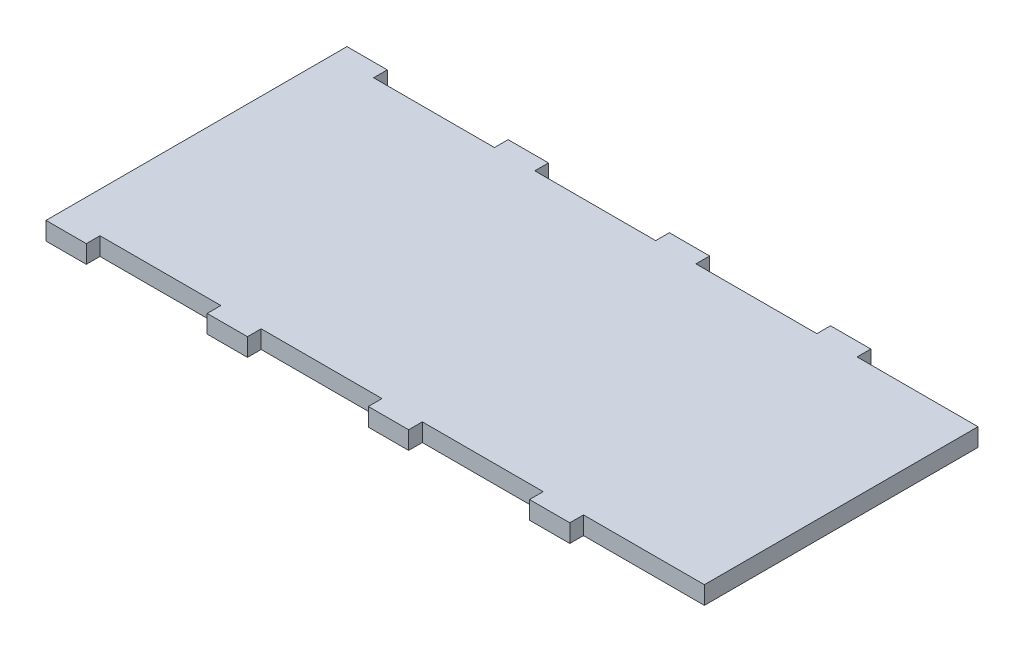
ISO-10303-21;
HEADER;
FILE_DESCRIPTION(('STEP AP214'),'2;1');
FILE_NAME('part.step','',(''),(''),'','','');
FILE_SCHEMA(('AUTOMOTIVE_DESIGN { 1 0 10303 214 1 1 1 1 }'));
ENDSEC;
DATA;
#1=APPLICATION_CONTEXT('core data for automotive mechanical design processes');
#2=APPLICATION_PROTOCOL_DEFINITION('international standard','automotive_design',2000,#1);
#3=PRODUCT_CONTEXT('',#1,'mechanical');
#4=PRODUCT('Part','Part','',(#3));
#5=PRODUCT_RELATED_PRODUCT_CATEGORY('part','',(#4));
#6=PRODUCT_DEFINITION_FORMATION('','',#4);
#7=PRODUCT_DEFINITION_CONTEXT('part definition',#1,'design');
#8=PRODUCT_DEFINITION('design','',#6,#7);
#9=PRODUCT_DEFINITION_SHAPE('','',#8);
#10=(LENGTH_UNIT() NAMED_UNIT(*) SI_UNIT(.MILLI.,.METRE.));
#11=(NAMED_UNIT(*) PLANE_ANGLE_UNIT() SI_UNIT($,.RADIAN.));
#12=(NAMED_UNIT(*) SI_UNIT($,.STERADIAN.) SOLID_ANGLE_UNIT());
#13=UNCERTAINTY_MEASURE_WITH_UNIT(LENGTH_MEASURE(1.E-05),#10,'distance_accuracy_value','');
#14=(GEOMETRIC_REPRESENTATION_CONTEXT(3) GLOBAL_UNCERTAINTY_ASSIGNED_CONTEXT((#13)) GLOBAL_UNIT_ASSIGNED_CONTEXT((#10,
#11,#12)) REPRESENTATION_CONTEXT('',''));
#15=CARTESIAN_POINT('',(0.,0.,0.));
#16=DIRECTION('',(0.,0.,1.));
#17=DIRECTION('',(1.,0.,0.));
#18=AXIS2_PLACEMENT_3D('',#15,#16,#17);
#19=CARTESIAN_POINT('',(22.4424875,2.54,0.));
#20=DIRECTION('',(-1.,0.,0.));
#21=DIRECTION('',(0.,0.,-1.));
#22=AXIS2_PLACEMENT_3D('',#19,#20,#21);
#23=PLANE('',#22);
#24=DIRECTION('',(0.,1.,0.));
#25=VECTOR('',#24,1.);
#26=CARTESIAN_POINT('',(22.4424875,2.54,7.62));
#27=LINE('',#26,#25);
#28=CARTESIAN_POINT('',(22.4424875,-7.46,7.62));
#29=VERTEX_POINT('',#28);
#30=CARTESIAN_POINT('',(22.4424875,2.54,7.62));
#31=VERTEX_POINT('',#30);
#32=EDGE_CURVE('E11',#29,#31,#27,.T.);
#33=ORIENTED_EDGE('',*,*,#32,.F.);
#34=DIRECTION('',(0.,0.,-1.));
#35=VECTOR('',#34,1.);
#36=CARTESIAN_POINT('',(22.4424875,-7.46,0.));
#37=LINE('',#36,#35);
#38=CARTESIAN_POINT('',(22.4424875,-7.46,0.));
#39=VERTEX_POINT('',#38);
#40=EDGE_CURVE('E178',#29,#39,#37,.T.);
#41=ORIENTED_EDGE('',*,*,#40,.T.);
#42=DIRECTION('',(0.,1.,0.));
#43=VECTOR('',#42,1.);
#44=CARTESIAN_POINT('',(22.4424875,2.54,0.));
#45=LINE('',#44,#43);
#46=CARTESIAN_POINT('',(22.4424875,2.54,0.));
#47=VERTEX_POINT('',#46);
#48=EDGE_CURVE('E49',#39,#47,#45,.T.);
#49=ORIENTED_EDGE('',*,*,#48,.T.);
#50=DIRECTION('',(0.,0.,-1.));
#51=VECTOR('',#50,1.);
#52=CARTESIAN_POINT('',(22.4424875,2.54,0.));
#53=LINE('',#52,#51);
#54=EDGE_CURVE('E361',#31,#47,#53,.T.);
#55=ORIENTED_EDGE('',*,*,#54,.F.);
#56=EDGE_LOOP('',(#33,#41,#49,#55));
#57=FACE_BOUND('',#56,.T.);
#58=ADVANCED_FACE('F39',(#57),#23,.F.);
#59=CARTESIAN_POINT('',(0.,2.54,0.));
#60=DIRECTION('',(0.,0.,-1.));
#61=DIRECTION('',(1.,0.,0.));
#62=AXIS2_PLACEMENT_3D('',#59,#60,#61);
#63=PLANE('',#62);
#64=ORIENTED_EDGE('',*,*,#48,.F.);
#65=DIRECTION('',(1.,0.,0.));
#66=VECTOR('',#65,1.);
#67=CARTESIAN_POINT('',(0.,-7.46,0.));
#68=LINE('',#67,#66);
#69=CARTESIAN_POINT('',(89.76995,-7.46,0.));
#70=VERTEX_POINT('',#69);
#71=EDGE_CURVE('E269',#39,#70,#68,.T.);
#72=ORIENTED_EDGE('',*,*,#71,.T.);
#73=DIRECTION('',(0.,1.,0.));
#74=VECTOR('',#73,1.);
#75=CARTESIAN_POINT('',(89.76995,2.54,0.));
#76=LINE('',#75,#74);
#77=CARTESIAN_POINT('',(89.76995,2.54,0.));
#78=VERTEX_POINT('',#77);
#79=EDGE_CURVE('E354',#70,#78,#76,.T.);
#80=ORIENTED_EDGE('',*,*,#79,.T.);
#81=DIRECTION('',(1.,0.,0.));
#82=VECTOR('',#81,1.);
#83=CARTESIAN_POINT('',(0.,2.54,0.));
#84=LINE('',#83,#82);
#85=EDGE_CURVE('E370',#47,#78,#84,.T.);
#86=ORIENTED_EDGE('',*,*,#85,.F.);
#87=EDGE_LOOP('',(#64,#72,#80,#86));
#88=FACE_BOUND('',#87,.T.);
#89=ADVANCED_FACE('F373',(#88),#63,.F.);
#90=CARTESIAN_POINT('',(89.76995,2.54,0.));
#91=DIRECTION('',(1.,0.,0.));
#92=DIRECTION('',(0.,0.,1.));
#93=AXIS2_PLACEMENT_3D('',#90,#91,#92);
#94=PLANE('',#93);
#95=ORIENTED_EDGE('',*,*,#79,.F.);
#96=DIRECTION('',(0.,0.,-1.));
#97=VECTOR('',#96,1.);
#98=CARTESIAN_POINT('',(89.76995,-7.46,0.));
#99=LINE('',#98,#97);
#100=CARTESIAN_POINT('',(89.76995,-7.46,7.61999999999999));
#101=VERTEX_POINT('',#100);
#102=EDGE_CURVE('E266',#70,#101,#99,.F.);
#103=ORIENTED_EDGE('',*,*,#102,.T.);
#104=DIRECTION('',(0.,1.,0.));
#105=VECTOR('',#104,1.);
#106=CARTESIAN_POINT('',(89.76995,2.54,7.61999999999999));
#107=LINE('',#106,#105);
#108=CARTESIAN_POINT('',(89.76995,2.54,7.61999999999999));
#109=VERTEX_POINT('',#108);
#110=EDGE_CURVE('E351',#101,#109,#107,.T.);
#111=ORIENTED_EDGE('',*,*,#110,.T.);
#112=DIRECTION('',(0.,0.,1.));
#113=VECTOR('',#112,1.);
#114=CARTESIAN_POINT('',(89.76995,2.54,0.));
#115=LINE('',#114,#113);
#116=EDGE_CURVE('E374',#78,#109,#115,.T.);
#117=ORIENTED_EDGE('',*,*,#116,.F.);
#118=EDGE_LOOP('',(#95,#103,#111,#117));
#119=FACE_BOUND('',#118,.T.);
#120=ADVANCED_FACE('F546',(#119),#94,.F.);
#121=CARTESIAN_POINT('',(89.76995,2.54,7.61999999999999));
#122=DIRECTION('',(0.,0.,-1.));
#123=DIRECTION('',(1.,0.,0.));
#124=AXIS2_PLACEMENT_3D('',#121,#122,#123);
#125=PLANE('',#124);
#126=ORIENTED_EDGE('',*,*,#110,.F.);
#127=DIRECTION('',(1.,0.,0.));
#128=VECTOR('',#127,1.);
#129=CARTESIAN_POINT('',(0.,-7.46,7.61999999999999));
#130=LINE('',#129,#128);
#131=CARTESIAN_POINT('',(112.2124375,-7.46,7.61999999999999));
#132=VERTEX_POINT('',#131);
#133=EDGE_CURVE('E263',#101,#132,#130,.T.);
#134=ORIENTED_EDGE('',*,*,#133,.T.);
#135=DIRECTION('',(0.,1.,0.));
#136=VECTOR('',#135,1.);
#137=CARTESIAN_POINT('',(112.2124375,2.54,7.61999999999999));
#138=LINE('',#137,#136);
#139=CARTESIAN_POINT('',(112.2124375,2.54,7.61999999999999));
#140=VERTEX_POINT('',#139);
#141=EDGE_CURVE('E348',#132,#140,#138,.T.);
#142=ORIENTED_EDGE('',*,*,#141,.T.);
#143=DIRECTION('',(1.,0.,0.));
#144=VECTOR('',#143,1.);
#145=CARTESIAN_POINT('',(89.76995,2.54,7.61999999999999));
#146=LINE('',#145,#144);
#147=EDGE_CURVE('E378',#109,#140,#146,.T.);
#148=ORIENTED_EDGE('',*,*,#147,.F.);
#149=EDGE_LOOP('',(#126,#134,#142,#148));
#150=FACE_BOUND('',#149,.T.);
#151=ADVANCED_FACE('F553',(#150),#125,.F.);
#152=CARTESIAN_POINT('',(112.2124375,2.54,0.));
#153=DIRECTION('',(-1.,0.,0.));
#154=DIRECTION('',(0.,0.,-1.));
#155=AXIS2_PLACEMENT_3D('',#152,#153,#154);
#156=PLANE('',#155);
#157=ORIENTED_EDGE('',*,*,#141,.F.);
#158=DIRECTION('',(0.,0.,-1.));
#159=VECTOR('',#158,1.);
#160=CARTESIAN_POINT('',(112.2124375,-7.46,0.));
#161=LINE('',#160,#159);
#162=CARTESIAN_POINT('',(112.2124375,-7.46,0.));
#163=VERTEX_POINT('',#162);
#164=EDGE_CURVE('E260',#132,#163,#161,.T.);
#165=ORIENTED_EDGE('',*,*,#164,.T.);
#166=DIRECTION('',(0.,1.,0.));
#167=VECTOR('',#166,1.);
#168=CARTESIAN_POINT('',(112.2124375,2.54,0.));
#169=LINE('',#168,#167);
#170=CARTESIAN_POINT('',(112.2124375,2.54,0.));
#171=VERTEX_POINT('',#170);
#172=EDGE_CURVE('E345',#163,#171,#169,.T.);
#173=ORIENTED_EDGE('',*,*,#172,.T.);
#174=DIRECTION('',(0.,0.,-1.));
#175=VECTOR('',#174,1.);
#176=CARTESIAN_POINT('',(112.2124375,2.54,0.));
#177=LINE('',#176,#175);
#178=EDGE_CURVE('E386',#140,#171,#177,.T.);
#179=ORIENTED_EDGE('',*,*,#178,.F.);
#180=EDGE_LOOP('',(#157,#165,#173,#179));
#181=FACE_BOUND('',#180,.T.);
#182=ADVANCED_FACE('F557',(#181),#156,.F.);
#183=ORIENTED_EDGE('',*,*,#172,.F.);
#184=DIRECTION('',(1.,0.,0.));
#185=VECTOR('',#184,1.);
#186=CARTESIAN_POINT('',(0.,-7.46,0.));
#187=LINE('',#186,#185);
#188=CARTESIAN_POINT('',(179.5399,-7.46,0.));
#189=VERTEX_POINT('',#188);
#190=EDGE_CURVE('E257',#163,#189,#187,.T.);
#191=ORIENTED_EDGE('',*,*,#190,.T.);
#192=DIRECTION('',(0.,1.,0.));
#193=VECTOR('',#192,1.);
#194=CARTESIAN_POINT('',(179.5399,2.54,0.));
#195=LINE('',#194,#193);
#196=CARTESIAN_POINT('',(179.5399,2.54,0.));
#197=VERTEX_POINT('',#196);
#198=EDGE_CURVE('E342',#189,#197,#195,.T.);
#199=ORIENTED_EDGE('',*,*,#198,.T.);
#200=EDGE_CURVE('E377',#171,#197,#84,.T.);
#201=ORIENTED_EDGE('',*,*,#200,.F.);
#202=EDGE_LOOP('',(#183,#191,#199,#201));
#203=FACE_BOUND('',#202,.T.);
#204=ADVANCED_FACE('F562',(#203),#63,.F.);
#205=CARTESIAN_POINT('',(179.5399,2.54,0.));
#206=DIRECTION('',(1.,0.,0.));
#207=DIRECTION('',(0.,0.,1.));
#208=AXIS2_PLACEMENT_3D('',#205,#206,#207);
#209=PLANE('',#208);
#210=ORIENTED_EDGE('',*,*,#198,.F.);
#211=DIRECTION('',(0.,0.,-1.));
#212=VECTOR('',#211,1.);
#213=CARTESIAN_POINT('',(179.5399,-7.46,0.));
#214=LINE('',#213,#212);
#215=CARTESIAN_POINT('',(179.5399,-7.46,7.61999999999999));
#216=VERTEX_POINT('',#215);
#217=EDGE_CURVE('E254',#189,#216,#214,.F.);
#218=ORIENTED_EDGE('',*,*,#217,.T.);
#219=DIRECTION('',(0.,1.,0.));
#220=VECTOR('',#219,1.);
#221=CARTESIAN_POINT('',(179.5399,2.54,7.61999999999999));
#222=LINE('',#221,#220);
#223=CARTESIAN_POINT('',(179.5399,2.54,7.61999999999999));
#224=VERTEX_POINT('',#223);
#225=EDGE_CURVE('E339',#216,#224,#222,.T.);
#226=ORIENTED_EDGE('',*,*,#225,.T.);
#227=DIRECTION('',(0.,0.,1.));
#228=VECTOR('',#227,1.);
#229=CARTESIAN_POINT('',(179.5399,2.54,0.));
#230=LINE('',#229,#228);
#231=EDGE_CURVE('E385',#197,#224,#230,.T.);
#232=ORIENTED_EDGE('',*,*,#231,.F.);
#233=EDGE_LOOP('',(#210,#218,#226,#232));
#234=FACE_BOUND('',#233,.T.);
#235=ADVANCED_FACE('F564',(#234),#209,.F.);
#236=CARTESIAN_POINT('',(179.5399,2.54,7.61999999999999));
#237=DIRECTION('',(0.,0.,-1.));
#238=DIRECTION('',(1.,0.,0.));
#239=AXIS2_PLACEMENT_3D('',#236,#237,#238);
#240=PLANE('',#239);
#241=ORIENTED_EDGE('',*,*,#225,.F.);
#242=DIRECTION('',(1.,0.,0.));
#243=VECTOR('',#242,1.);
#244=CARTESIAN_POINT('',(0.,-7.46,7.61999999999999));
#245=LINE('',#244,#243);
#246=CARTESIAN_POINT('',(201.9823875,-7.46,7.61999999999999));
#247=VERTEX_POINT('',#246);
#248=EDGE_CURVE('E251',#216,#247,#245,.T.);
#249=ORIENTED_EDGE('',*,*,#248,.T.);
#250=DIRECTION('',(0.,1.,0.));
#251=VECTOR('',#250,1.);
#252=CARTESIAN_POINT('',(201.9823875,2.54,7.61999999999999));
#253=LINE('',#252,#251);
#254=CARTESIAN_POINT('',(201.9823875,2.54,7.61999999999999));
#255=VERTEX_POINT('',#254);
#256=EDGE_CURVE('E336',#247,#255,#253,.T.);
#257=ORIENTED_EDGE('',*,*,#256,.T.);
#258=DIRECTION('',(1.,0.,0.));
#259=VECTOR('',#258,1.);
#260=CARTESIAN_POINT('',(179.5399,2.54,7.61999999999999));
#261=LINE('',#260,#259);
#262=EDGE_CURVE('E392',#224,#255,#261,.T.);
#263=ORIENTED_EDGE('',*,*,#262,.F.);
#264=EDGE_LOOP('',(#241,#249,#257,#263));
#265=FACE_BOUND('',#264,.T.);
#266=ADVANCED_FACE('F567',(#265),#240,.F.);
#267=CARTESIAN_POINT('',(201.9823875,2.54,0.));
#268=DIRECTION('',(-1.,0.,0.));
#269=DIRECTION('',(0.,0.,-1.));
#270=AXIS2_PLACEMENT_3D('',#267,#268,#269);
#271=PLANE('',#270);
#272=ORIENTED_EDGE('',*,*,#256,.F.);
#273=DIRECTION('',(0.,0.,-1.));
#274=VECTOR('',#273,1.);
#275=CARTESIAN_POINT('',(201.9823875,-7.46,0.));
#276=LINE('',#275,#274);
#277=CARTESIAN_POINT('',(201.9823875,-7.46,0.));
#278=VERTEX_POINT('',#277);
#279=EDGE_CURVE('E248',#247,#278,#276,.T.);
#280=ORIENTED_EDGE('',*,*,#279,.T.);
#281=DIRECTION('',(0.,1.,0.));
#282=VECTOR('',#281,1.);
#283=CARTESIAN_POINT('',(201.9823875,2.54,0.));
#284=LINE('',#283,#282);
#285=CARTESIAN_POINT('',(201.9823875,2.54,0.));
#286=VERTEX_POINT('',#285);
#287=EDGE_CURVE('E333',#278,#286,#284,.T.);
#288=ORIENTED_EDGE('',*,*,#287,.T.);
#289=DIRECTION('',(0.,0.,-1.));
#290=VECTOR('',#289,1.);
#291=CARTESIAN_POINT('',(201.9823875,2.54,0.));
#292=LINE('',#291,#290);
#293=EDGE_CURVE('E397',#255,#286,#292,.T.);
#294=ORIENTED_EDGE('',*,*,#293,.F.);
#295=EDGE_LOOP('',(#272,#280,#288,#294));
#296=FACE_BOUND('',#295,.T.);
#297=ADVANCED_FACE('F570',(#296),#271,.F.);
#298=ORIENTED_EDGE('',*,*,#287,.F.);
#299=DIRECTION('',(1.,0.,0.));
#300=VECTOR('',#299,1.);
#301=CARTESIAN_POINT('',(0.,-7.46,0.));
#302=LINE('',#301,#300);
#303=CARTESIAN_POINT('',(269.30985,-7.46,0.));
#304=VERTEX_POINT('',#303);
#305=EDGE_CURVE('E245',#278,#304,#302,.T.);
#306=ORIENTED_EDGE('',*,*,#305,.T.);
#307=DIRECTION('',(0.,1.,0.));
#308=VECTOR('',#307,1.);
#309=CARTESIAN_POINT('',(269.30985,2.54,0.));
#310=LINE('',#309,#308);
#311=CARTESIAN_POINT('',(269.30985,2.54,0.));
#312=VERTEX_POINT('',#311);
#313=EDGE_CURVE('E330',#304,#312,#310,.T.);
#314=ORIENTED_EDGE('',*,*,#313,.T.);
#315=EDGE_CURVE('E383',#286,#312,#84,.T.);
#316=ORIENTED_EDGE('',*,*,#315,.F.);
#317=EDGE_LOOP('',(#298,#306,#314,#316));
#318=FACE_BOUND('',#317,.T.);
#319=ADVANCED_FACE('F575',(#318),#63,.F.);
#320=CARTESIAN_POINT('',(269.30985,2.54,0.));
#321=DIRECTION('',(1.,0.,0.));
#322=DIRECTION('',(0.,0.,1.));
#323=AXIS2_PLACEMENT_3D('',#320,#321,#322);
#324=PLANE('',#323);
#325=ORIENTED_EDGE('',*,*,#313,.F.);
#326=DIRECTION('',(0.,0.,-1.));
#327=VECTOR('',#326,1.);
#328=CARTESIAN_POINT('',(269.30985,-7.46,0.));
#329=LINE('',#328,#327);
#330=CARTESIAN_POINT('',(269.30985,-7.46,7.61999999999998));
#331=VERTEX_POINT('',#330);
#332=EDGE_CURVE('E242',#304,#331,#329,.F.);
#333=ORIENTED_EDGE('',*,*,#332,.T.);
#334=DIRECTION('',(0.,1.,0.));
#335=VECTOR('',#334,1.);
#336=CARTESIAN_POINT('',(269.30985,2.54,7.61999999999998));
#337=LINE('',#336,#335);
#338=CARTESIAN_POINT('',(269.30985,2.54,7.61999999999998));
#339=VERTEX_POINT('',#338);
#340=EDGE_CURVE('E327',#331,#339,#337,.T.);
#341=ORIENTED_EDGE('',*,*,#340,.T.);
#342=DIRECTION('',(0.,0.,1.));
#343=VECTOR('',#342,1.);
#344=CARTESIAN_POINT('',(269.30985,2.54,0.));
#345=LINE('',#344,#343);
#346=EDGE_CURVE('E396',#312,#339,#345,.T.);
#347=ORIENTED_EDGE('',*,*,#346,.F.);
#348=EDGE_LOOP('',(#325,#333,#341,#347));
#349=FACE_BOUND('',#348,.T.);
#350=ADVANCED_FACE('F577',(#349),#324,.F.);
#351=CARTESIAN_POINT('',(269.30985,2.54,7.61999999999998));
#352=DIRECTION('',(0.,0.,-1.));
#353=DIRECTION('',(1.,0.,0.));
#354=AXIS2_PLACEMENT_3D('',#351,#352,#353);
#355=PLANE('',#354);
#356=ORIENTED_EDGE('',*,*,#340,.F.);
#357=DIRECTION('',(1.,0.,0.));
#358=VECTOR('',#357,1.);
#359=CARTESIAN_POINT('',(0.,-7.46,7.61999999999998));
#360=LINE('',#359,#358);
#361=CARTESIAN_POINT('',(291.7523375,-7.46,7.61999999999998));
#362=VERTEX_POINT('',#361);
#363=EDGE_CURVE('E239',#331,#362,#360,.T.);
#364=ORIENTED_EDGE('',*,*,#363,.T.);
#365=DIRECTION('',(0.,1.,0.));
#366=VECTOR('',#365,1.);
#367=CARTESIAN_POINT('',(291.7523375,2.54,7.61999999999998));
#368=LINE('',#367,#366);
#369=CARTESIAN_POINT('',(291.7523375,2.54,7.61999999999998));
#370=VERTEX_POINT('',#369);
#371=EDGE_CURVE('E324',#362,#370,#368,.T.);
#372=ORIENTED_EDGE('',*,*,#371,.T.);
#373=DIRECTION('',(1.,0.,0.));
#374=VECTOR('',#373,1.);
#375=CARTESIAN_POINT('',(269.30985,2.54,7.61999999999998));
#376=LINE('',#375,#374);
#377=EDGE_CURVE('E403',#339,#370,#376,.T.);
#378=ORIENTED_EDGE('',*,*,#377,.F.);
#379=EDGE_LOOP('',(#356,#364,#372,#378));
#380=FACE_BOUND('',#379,.T.);
#381=ADVANCED_FACE('F581',(#380),#355,.F.);
#382=CARTESIAN_POINT('',(291.7523375,2.54,0.));
#383=DIRECTION('',(-1.,0.,0.));
#384=DIRECTION('',(0.,0.,-1.));
#385=AXIS2_PLACEMENT_3D('',#382,#383,#384);
#386=PLANE('',#385);
#387=ORIENTED_EDGE('',*,*,#371,.F.);
#388=DIRECTION('',(0.,0.,-1.));
#389=VECTOR('',#388,1.);
#390=CARTESIAN_POINT('',(291.7523375,-7.46,0.));
#391=LINE('',#390,#389);
#392=CARTESIAN_POINT('',(291.7523375,-7.46,0.));
#393=VERTEX_POINT('',#392);
#394=EDGE_CURVE('E236',#362,#393,#391,.T.);
#395=ORIENTED_EDGE('',*,*,#394,.T.);
#396=DIRECTION('',(0.,1.,0.));
#397=VECTOR('',#396,1.);
#398=CARTESIAN_POINT('',(291.7523375,2.54,0.));
#399=LINE('',#398,#397);
#400=CARTESIAN_POINT('',(291.7523375,2.54,0.));
#401=VERTEX_POINT('',#400);
#402=EDGE_CURVE('E321',#393,#401,#399,.T.);
#403=ORIENTED_EDGE('',*,*,#402,.T.);
#404=DIRECTION('',(0.,0.,-1.));
#405=VECTOR('',#404,1.);
#406=CARTESIAN_POINT('',(291.7523375,2.54,0.));
#407=LINE('',#406,#405);
#408=EDGE_CURVE('E382',#370,#401,#407,.T.);
#409=ORIENTED_EDGE('',*,*,#408,.F.);
#410=EDGE_LOOP('',(#387,#395,#403,#409));
#411=FACE_BOUND('',#410,.T.);
#412=ADVANCED_FACE('F584',(#411),#386,.F.);
#413=ORIENTED_EDGE('',*,*,#402,.F.);
#414=DIRECTION('',(1.,0.,0.));
#415=VECTOR('',#414,1.);
#416=CARTESIAN_POINT('',(0.,-7.46,0.));
#417=LINE('',#416,#415);
#418=CARTESIAN_POINT('',(359.0798,-7.46,0.));
#419=VERTEX_POINT('',#418);
#420=EDGE_CURVE('E233',#393,#419,#417,.T.);
#421=ORIENTED_EDGE('',*,*,#420,.T.);
#422=DIRECTION('',(0.,1.,0.));
#423=VECTOR('',#422,1.);
#424=CARTESIAN_POINT('',(359.0798,2.54,0.));
#425=LINE('',#424,#423);
#426=CARTESIAN_POINT('',(359.0798,2.54,0.));
#427=VERTEX_POINT('',#426);
#428=EDGE_CURVE('E318',#419,#427,#425,.T.);
#429=ORIENTED_EDGE('',*,*,#428,.T.);
#430=EDGE_CURVE('E376',#401,#427,#84,.T.);
#431=ORIENTED_EDGE('',*,*,#430,.F.);
#432=EDGE_LOOP('',(#413,#421,#429,#431));
#433=FACE_BOUND('',#432,.T.);
#434=ADVANCED_FACE('F589',(#433),#63,.F.);
#435=CARTESIAN_POINT('',(359.0798,2.54,0.));
#436=DIRECTION('',(-1.,0.,0.));
#437=DIRECTION('',(0.,0.,-1.));
#438=AXIS2_PLACEMENT_3D('',#435,#436,#437);
#439=PLANE('',#438);
#440=ORIENTED_EDGE('',*,*,#428,.F.);
#441=DIRECTION('',(0.,0.,-1.));
#442=VECTOR('',#441,1.);
#443=CARTESIAN_POINT('',(359.0798,-7.46,0.));
#444=LINE('',#443,#442);
#445=CARTESIAN_POINT('',(359.0798,-7.46,-152.4));
#446=VERTEX_POINT('',#445);
#447=EDGE_CURVE('E230',#419,#446,#444,.T.);
#448=ORIENTED_EDGE('',*,*,#447,.T.);
#449=DIRECTION('',(0.,1.,0.));
#450=VECTOR('',#449,1.);
#451=CARTESIAN_POINT('',(359.0798,2.54,-152.4));
#452=LINE('',#451,#450);
#453=CARTESIAN_POINT('',(359.0798,2.54,-152.4));
#454=VERTEX_POINT('',#453);
#455=EDGE_CURVE('E315',#446,#454,#452,.T.);
#456=ORIENTED_EDGE('',*,*,#455,.T.);
#457=DIRECTION('',(0.,0.,-1.));
#458=VECTOR('',#457,1.);
#459=CARTESIAN_POINT('',(359.0798,2.54,0.));
#460=LINE('',#459,#458);
#461=EDGE_CURVE('E381',#427,#454,#460,.T.);
#462=ORIENTED_EDGE('',*,*,#461,.F.);
#463=EDGE_LOOP('',(#440,#448,#456,#462));
#464=FACE_BOUND('',#463,.T.);
#465=ADVANCED_FACE('F594',(#464),#439,.F.);
#466=CARTESIAN_POINT('',(0.,2.54,-152.4));
#467=DIRECTION('',(0.,0.,1.));
#468=DIRECTION('',(-1.,0.,0.));
#469=AXIS2_PLACEMENT_3D('',#466,#467,#468);
#470=PLANE('',#469);
#471=ORIENTED_EDGE('',*,*,#455,.F.);
#472=DIRECTION('',(1.,0.,0.));
#473=VECTOR('',#472,1.);
#474=CARTESIAN_POINT('',(0.,-7.46,-152.4));
#475=LINE('',#474,#473);
#476=CARTESIAN_POINT('',(291.7523375,-7.46,-152.4));
#477=VERTEX_POINT('',#476);
#478=EDGE_CURVE('E227',#446,#477,#475,.F.);
#479=ORIENTED_EDGE('',*,*,#478,.T.);
#480=DIRECTION('',(0.,1.,0.));
#481=VECTOR('',#480,1.);
#482=CARTESIAN_POINT('',(291.7523375,2.54,-152.4));
#483=LINE('',#482,#481);
#484=CARTESIAN_POINT('',(291.7523375,2.54,-152.4));
#485=VERTEX_POINT('',#484);
#486=EDGE_CURVE('E312',#477,#485,#483,.T.);
#487=ORIENTED_EDGE('',*,*,#486,.T.);
#488=DIRECTION('',(-1.,0.,0.));
#489=VECTOR('',#488,1.);
#490=CARTESIAN_POINT('',(0.,2.54,-152.4));
#491=LINE('',#490,#489);
#492=EDGE_CURVE('E417',#454,#485,#491,.T.);
#493=ORIENTED_EDGE('',*,*,#492,.F.);
#494=EDGE_LOOP('',(#471,#479,#487,#493));
#495=FACE_BOUND('',#494,.T.);
#496=ADVANCED_FACE('F596',(#495),#470,.F.);
#497=CARTESIAN_POINT('',(291.7523375,2.54,-152.4));
#498=DIRECTION('',(-1.,0.,0.));
#499=DIRECTION('',(0.,0.,-1.));
#500=AXIS2_PLACEMENT_3D('',#497,#498,#499);
#501=PLANE('',#500);
#502=ORIENTED_EDGE('',*,*,#486,.F.);
#503=DIRECTION('',(0.,0.,-1.));
#504=VECTOR('',#503,1.);
#505=CARTESIAN_POINT('',(291.7523375,-7.46,0.));
#506=LINE('',#505,#504);
#507=CARTESIAN_POINT('',(291.7523375,-7.46,-160.02));
#508=VERTEX_POINT('',#507);
#509=EDGE_CURVE('E224',#477,#508,#506,.T.);
#510=ORIENTED_EDGE('',*,*,#509,.T.);
#511=DIRECTION('',(0.,1.,0.));
#512=VECTOR('',#511,1.);
#513=CARTESIAN_POINT('',(291.7523375,2.54,-160.02));
#514=LINE('',#513,#512);
#515=CARTESIAN_POINT('',(291.7523375,2.54,-160.02));
#516=VERTEX_POINT('',#515);
#517=EDGE_CURVE('E309',#508,#516,#514,.T.);
#518=ORIENTED_EDGE('',*,*,#517,.T.);
#519=DIRECTION('',(0.,0.,-1.));
#520=VECTOR('',#519,1.);
#521=CARTESIAN_POINT('',(291.7523375,2.54,-152.4));
#522=LINE('',#521,#520);
#523=EDGE_CURVE('E420',#485,#516,#522,.T.);
#524=ORIENTED_EDGE('',*,*,#523,.F.);
#525=EDGE_LOOP('',(#502,#510,#518,#524));
#526=FACE_BOUND('',#525,.T.);
#527=ADVANCED_FACE('F601',(#526),#501,.F.);
#528=CARTESIAN_POINT('',(269.30985,2.54,-160.02));
#529=DIRECTION('',(0.,0.,1.));
#530=DIRECTION('',(-1.,0.,0.));
#531=AXIS2_PLACEMENT_3D('',#528,#529,#530);
#532=PLANE('',#531);
#533=ORIENTED_EDGE('',*,*,#517,.F.);
#534=DIRECTION('',(1.,0.,0.));
#535=VECTOR('',#534,1.);
#536=CARTESIAN_POINT('',(0.,-7.46,-160.02));
#537=LINE('',#536,#535);
#538=CARTESIAN_POINT('',(269.30985,-7.46,-160.02));
#539=VERTEX_POINT('',#538);
#540=EDGE_CURVE('E221',#508,#539,#537,.F.);
#541=ORIENTED_EDGE('',*,*,#540,.T.);
#542=DIRECTION('',(0.,1.,0.));
#543=VECTOR('',#542,1.);
#544=CARTESIAN_POINT('',(269.30985,2.54,-160.02));
#545=LINE('',#544,#543);
#546=CARTESIAN_POINT('',(269.30985,2.54,-160.02));
#547=VERTEX_POINT('',#546);
#548=EDGE_CURVE('E306',#539,#547,#545,.T.);
#549=ORIENTED_EDGE('',*,*,#548,.T.);
#550=DIRECTION('',(-1.,0.,0.));
#551=VECTOR('',#550,1.);
#552=CARTESIAN_POINT('',(269.30985,2.54,-160.02));
#553=LINE('',#552,#551);
#554=EDGE_CURVE('E425',#516,#547,#553,.T.);
#555=ORIENTED_EDGE('',*,*,#554,.F.);
#556=EDGE_LOOP('',(#533,#541,#549,#555));
#557=FACE_BOUND('',#556,.T.);
#558=ADVANCED_FACE('F605',(#557),#532,.F.);
#559=CARTESIAN_POINT('',(269.30985,2.54,-152.4));
#560=DIRECTION('',(1.,0.,0.));
#561=DIRECTION('',(0.,0.,1.));
#562=AXIS2_PLACEMENT_3D('',#559,#560,#561);
#563=PLANE('',#562);
#564=ORIENTED_EDGE('',*,*,#548,.F.);
#565=DIRECTION('',(0.,0.,-1.));
#566=VECTOR('',#565,1.);
#567=CARTESIAN_POINT('',(269.30985,-7.46,0.));
#568=LINE('',#567,#566);
#569=CARTESIAN_POINT('',(269.30985,-7.46,-152.4));
#570=VERTEX_POINT('',#569);
#571=EDGE_CURVE('E218',#539,#570,#568,.F.);
#572=ORIENTED_EDGE('',*,*,#571,.T.);
#573=DIRECTION('',(0.,1.,0.));
#574=VECTOR('',#573,1.);
#575=CARTESIAN_POINT('',(269.30985,2.54,-152.4));
#576=LINE('',#575,#574);
#577=CARTESIAN_POINT('',(269.30985,2.54,-152.4));
#578=VERTEX_POINT('',#577);
#579=EDGE_CURVE('E303',#570,#578,#576,.T.);
#580=ORIENTED_EDGE('',*,*,#579,.T.);
#581=DIRECTION('',(0.,0.,1.));
#582=VECTOR('',#581,1.);
#583=CARTESIAN_POINT('',(269.30985,2.54,-152.4));
#584=LINE('',#583,#582);
#585=EDGE_CURVE('E428',#547,#578,#584,.T.);
#586=ORIENTED_EDGE('',*,*,#585,.F.);
#587=EDGE_LOOP('',(#564,#572,#580,#586));
#588=FACE_BOUND('',#587,.T.);
#589=ADVANCED_FACE('F607',(#588),#563,.F.);
#590=ORIENTED_EDGE('',*,*,#579,.F.);
#591=DIRECTION('',(1.,0.,0.));
#592=VECTOR('',#591,1.);
#593=CARTESIAN_POINT('',(0.,-7.46,-152.4));
#594=LINE('',#593,#592);
#595=CARTESIAN_POINT('',(201.9823875,-7.46,-152.4));
#596=VERTEX_POINT('',#595);
#597=EDGE_CURVE('E215',#570,#596,#594,.F.);
#598=ORIENTED_EDGE('',*,*,#597,.T.);
#599=DIRECTION('',(0.,1.,0.));
#600=VECTOR('',#599,1.);
#601=CARTESIAN_POINT('',(201.9823875,2.54,-152.4));
#602=LINE('',#601,#600);
#603=CARTESIAN_POINT('',(201.9823875,2.54,-152.4));
#604=VERTEX_POINT('',#603);
#605=EDGE_CURVE('E300',#596,#604,#602,.T.);
#606=ORIENTED_EDGE('',*,*,#605,.T.);
#607=EDGE_CURVE('E422',#578,#604,#491,.T.);
#608=ORIENTED_EDGE('',*,*,#607,.F.);
#609=EDGE_LOOP('',(#590,#598,#606,#608));
#610=FACE_BOUND('',#609,.T.);
#611=ADVANCED_FACE('F608',(#610),#470,.F.);
#612=CARTESIAN_POINT('',(201.9823875,2.54,-152.4));
#613=DIRECTION('',(-1.,0.,0.));
#614=DIRECTION('',(0.,0.,-1.));
#615=AXIS2_PLACEMENT_3D('',#612,#613,#614);
#616=PLANE('',#615);
#617=ORIENTED_EDGE('',*,*,#605,.F.);
#618=DIRECTION('',(0.,0.,-1.));
#619=VECTOR('',#618,1.);
#620=CARTESIAN_POINT('',(201.9823875,-7.46,0.));
#621=LINE('',#620,#619);
#622=CARTESIAN_POINT('',(201.9823875,-7.46,-160.02));
#623=VERTEX_POINT('',#622);
#624=EDGE_CURVE('E212',#596,#623,#621,.T.);
#625=ORIENTED_EDGE('',*,*,#624,.T.);
#626=DIRECTION('',(0.,1.,0.));
#627=VECTOR('',#626,1.);
#628=CARTESIAN_POINT('',(201.9823875,2.54,-160.02));
#629=LINE('',#628,#627);
#630=CARTESIAN_POINT('',(201.9823875,2.54,-160.02));
#631=VERTEX_POINT('',#630);
#632=EDGE_CURVE('E297',#623,#631,#629,.T.);
#633=ORIENTED_EDGE('',*,*,#632,.T.);
#634=DIRECTION('',(0.,0.,-1.));
#635=VECTOR('',#634,1.);
#636=CARTESIAN_POINT('',(201.9823875,2.54,-152.4));
#637=LINE('',#636,#635);
#638=EDGE_CURVE('E431',#604,#631,#637,.T.);
#639=ORIENTED_EDGE('',*,*,#638,.F.);
#640=EDGE_LOOP('',(#617,#625,#633,#639));
#641=FACE_BOUND('',#640,.T.);
#642=ADVANCED_FACE('F470',(#641),#616,.F.);
#643=CARTESIAN_POINT('',(179.5399,2.54,-160.02));
#644=DIRECTION('',(0.,0.,1.));
#645=DIRECTION('',(-1.,0.,0.));
#646=AXIS2_PLACEMENT_3D('',#643,#644,#645);
#647=PLANE('',#646);
#648=ORIENTED_EDGE('',*,*,#632,.F.);
#649=DIRECTION('',(1.,0.,0.));
#650=VECTOR('',#649,1.);
#651=CARTESIAN_POINT('',(0.,-7.46,-160.02));
#652=LINE('',#651,#650);
#653=CARTESIAN_POINT('',(179.5399,-7.46,-160.02));
#654=VERTEX_POINT('',#653);
#655=EDGE_CURVE('E209',#623,#654,#652,.F.);
#656=ORIENTED_EDGE('',*,*,#655,.T.);
#657=DIRECTION('',(0.,1.,0.));
#658=VECTOR('',#657,1.);
#659=CARTESIAN_POINT('',(179.5399,2.54,-160.02));
#660=LINE('',#659,#658);
#661=CARTESIAN_POINT('',(179.5399,2.54,-160.02));
#662=VERTEX_POINT('',#661);
#663=EDGE_CURVE('E294',#654,#662,#660,.T.);
#664=ORIENTED_EDGE('',*,*,#663,.T.);
#665=DIRECTION('',(-1.,0.,0.));
#666=VECTOR('',#665,1.);
#667=CARTESIAN_POINT('',(179.5399,2.54,-160.02));
#668=LINE('',#667,#666);
#669=EDGE_CURVE('E434',#631,#662,#668,.T.);
#670=ORIENTED_EDGE('',*,*,#669,.F.);
#671=EDGE_LOOP('',(#648,#656,#664,#670));
#672=FACE_BOUND('',#671,.T.);
#673=ADVANCED_FACE('F476',(#672),#647,.F.);
#674=CARTESIAN_POINT('',(179.5399,2.54,-152.4));
#675=DIRECTION('',(1.,0.,0.));
#676=DIRECTION('',(0.,0.,1.));
#677=AXIS2_PLACEMENT_3D('',#674,#675,#676);
#678=PLANE('',#677);
#679=ORIENTED_EDGE('',*,*,#663,.F.);
#680=DIRECTION('',(0.,0.,-1.));
#681=VECTOR('',#680,1.);
#682=CARTESIAN_POINT('',(179.5399,-7.46,0.));
#683=LINE('',#682,#681);
#684=CARTESIAN_POINT('',(179.5399,-7.46,-152.4));
#685=VERTEX_POINT('',#684);
#686=EDGE_CURVE('E206',#654,#685,#683,.F.);
#687=ORIENTED_EDGE('',*,*,#686,.T.);
#688=DIRECTION('',(0.,1.,0.));
#689=VECTOR('',#688,1.);
#690=CARTESIAN_POINT('',(179.5399,2.54,-152.4));
#691=LINE('',#690,#689);
#692=CARTESIAN_POINT('',(179.5399,2.54,-152.4));
#693=VERTEX_POINT('',#692);
#694=EDGE_CURVE('E291',#685,#693,#691,.T.);
#695=ORIENTED_EDGE('',*,*,#694,.T.);
#696=DIRECTION('',(0.,0.,1.));
#697=VECTOR('',#696,1.);
#698=CARTESIAN_POINT('',(179.5399,2.54,-152.4));
#699=LINE('',#698,#697);
#700=EDGE_CURVE('E437',#662,#693,#699,.T.);
#701=ORIENTED_EDGE('',*,*,#700,.F.);
#702=EDGE_LOOP('',(#679,#687,#695,#701));
#703=FACE_BOUND('',#702,.T.);
#704=ADVANCED_FACE('F482',(#703),#678,.F.);
#705=ORIENTED_EDGE('',*,*,#694,.F.);
#706=DIRECTION('',(1.,0.,0.));
#707=VECTOR('',#706,1.);
#708=CARTESIAN_POINT('',(0.,-7.46,-152.4));
#709=LINE('',#708,#707);
#710=CARTESIAN_POINT('',(112.2124375,-7.46,-152.4));
#711=VERTEX_POINT('',#710);
#712=EDGE_CURVE('E203',#685,#711,#709,.F.);
#713=ORIENTED_EDGE('',*,*,#712,.T.);
#714=DIRECTION('',(0.,1.,0.));
#715=VECTOR('',#714,1.);
#716=CARTESIAN_POINT('',(112.2124375,2.54,-152.4));
#717=LINE('',#716,#715);
#718=CARTESIAN_POINT('',(112.2124375,2.54,-152.4));
#719=VERTEX_POINT('',#718);
#720=EDGE_CURVE('E288',#711,#719,#717,.T.);
#721=ORIENTED_EDGE('',*,*,#720,.T.);
#722=EDGE_CURVE('E440',#693,#719,#491,.T.);
#723=ORIENTED_EDGE('',*,*,#722,.F.);
#724=EDGE_LOOP('',(#705,#713,#721,#723));
#725=FACE_BOUND('',#724,.T.);
#726=ADVANCED_FACE('F488',(#725),#470,.F.);
#727=CARTESIAN_POINT('',(112.2124375,2.54,-152.4));
#728=DIRECTION('',(-1.,0.,0.));
#729=DIRECTION('',(0.,0.,-1.));
#730=AXIS2_PLACEMENT_3D('',#727,#728,#729);
#731=PLANE('',#730);
#732=ORIENTED_EDGE('',*,*,#720,.F.);
#733=DIRECTION('',(0.,0.,-1.));
#734=VECTOR('',#733,1.);
#735=CARTESIAN_POINT('',(112.2124375,-7.46,0.));
#736=LINE('',#735,#734);
#737=CARTESIAN_POINT('',(112.2124375,-7.46,-160.02));
#738=VERTEX_POINT('',#737);
#739=EDGE_CURVE('E200',#711,#738,#736,.T.);
#740=ORIENTED_EDGE('',*,*,#739,.T.);
#741=DIRECTION('',(0.,1.,0.));
#742=VECTOR('',#741,1.);
#743=CARTESIAN_POINT('',(112.2124375,2.54,-160.02));
#744=LINE('',#743,#742);
#745=CARTESIAN_POINT('',(112.2124375,2.54,-160.02));
#746=VERTEX_POINT('',#745);
#747=EDGE_CURVE('E285',#738,#746,#744,.T.);
#748=ORIENTED_EDGE('',*,*,#747,.T.);
#749=DIRECTION('',(0.,0.,-1.));
#750=VECTOR('',#749,1.);
#751=CARTESIAN_POINT('',(112.2124375,2.54,-152.4));
#752=LINE('',#751,#750);
#753=EDGE_CURVE('E441',#719,#746,#752,.T.);
#754=ORIENTED_EDGE('',*,*,#753,.F.);
#755=EDGE_LOOP('',(#732,#740,#748,#754));
#756=FACE_BOUND('',#755,.T.);
#757=ADVANCED_FACE('F492',(#756),#731,.F.);
#758=CARTESIAN_POINT('',(89.76995,2.54,-160.02));
#759=DIRECTION('',(0.,0.,1.));
#760=DIRECTION('',(-1.,0.,0.));
#761=AXIS2_PLACEMENT_3D('',#758,#759,#760);
#762=PLANE('',#761);
#763=ORIENTED_EDGE('',*,*,#747,.F.);
#764=DIRECTION('',(1.,0.,0.));
#765=VECTOR('',#764,1.);
#766=CARTESIAN_POINT('',(0.,-7.46,-160.02));
#767=LINE('',#766,#765);
#768=CARTESIAN_POINT('',(89.76995,-7.46,-160.02));
#769=VERTEX_POINT('',#768);
#770=EDGE_CURVE('E197',#738,#769,#767,.F.);
#771=ORIENTED_EDGE('',*,*,#770,.T.);
#772=DIRECTION('',(0.,1.,0.));
#773=VECTOR('',#772,1.);
#774=CARTESIAN_POINT('',(89.76995,2.54,-160.02));
#775=LINE('',#774,#773);
#776=CARTESIAN_POINT('',(89.76995,2.54,-160.02));
#777=VERTEX_POINT('',#776);
#778=EDGE_CURVE('E282',#769,#777,#775,.T.);
#779=ORIENTED_EDGE('',*,*,#778,.T.);
#780=DIRECTION('',(-1.,0.,0.));
#781=VECTOR('',#780,1.);
#782=CARTESIAN_POINT('',(89.76995,2.54,-160.02));
#783=LINE('',#782,#781);
#784=EDGE_CURVE('E444',#746,#777,#783,.T.);
#785=ORIENTED_EDGE('',*,*,#784,.F.);
#786=EDGE_LOOP('',(#763,#771,#779,#785));
#787=FACE_BOUND('',#786,.T.);
#788=ADVANCED_FACE('F497',(#787),#762,.F.);
#789=CARTESIAN_POINT('',(89.76995,2.54,-152.4));
#790=DIRECTION('',(1.,0.,0.));
#791=DIRECTION('',(0.,0.,1.));
#792=AXIS2_PLACEMENT_3D('',#789,#790,#791);
#793=PLANE('',#792);
#794=ORIENTED_EDGE('',*,*,#778,.F.);
#795=DIRECTION('',(0.,0.,-1.));
#796=VECTOR('',#795,1.);
#797=CARTESIAN_POINT('',(89.76995,-7.46,0.));
#798=LINE('',#797,#796);
#799=CARTESIAN_POINT('',(89.76995,-7.46,-152.4));
#800=VERTEX_POINT('',#799);
#801=EDGE_CURVE('E194',#769,#800,#798,.F.);
#802=ORIENTED_EDGE('',*,*,#801,.T.);
#803=DIRECTION('',(0.,1.,0.));
#804=VECTOR('',#803,1.);
#805=CARTESIAN_POINT('',(89.76995,2.54,-152.4));
#806=LINE('',#805,#804);
#807=CARTESIAN_POINT('',(89.76995,2.54,-152.4));
#808=VERTEX_POINT('',#807);
#809=EDGE_CURVE('E279',#800,#808,#806,.T.);
#810=ORIENTED_EDGE('',*,*,#809,.T.);
#811=DIRECTION('',(0.,0.,1.));
#812=VECTOR('',#811,1.);
#813=CARTESIAN_POINT('',(89.76995,2.54,-152.4));
#814=LINE('',#813,#812);
#815=EDGE_CURVE('E447',#777,#808,#814,.T.);
#816=ORIENTED_EDGE('',*,*,#815,.F.);
#817=EDGE_LOOP('',(#794,#802,#810,#816));
#818=FACE_BOUND('',#817,.T.);
#819=ADVANCED_FACE('F505',(#818),#793,.F.);
#820=ORIENTED_EDGE('',*,*,#809,.F.);
#821=DIRECTION('',(1.,0.,0.));
#822=VECTOR('',#821,1.);
#823=CARTESIAN_POINT('',(0.,-7.46,-152.4));
#824=LINE('',#823,#822);
#825=CARTESIAN_POINT('',(22.4424875,-7.46,-152.4));
#826=VERTEX_POINT('',#825);
#827=EDGE_CURVE('E191',#800,#826,#824,.F.);
#828=ORIENTED_EDGE('',*,*,#827,.T.);
#829=DIRECTION('',(0.,1.,0.));
#830=VECTOR('',#829,1.);
#831=CARTESIAN_POINT('',(22.4424875,2.54,-152.4));
#832=LINE('',#831,#830);
#833=CARTESIAN_POINT('',(22.4424875,2.54,-152.4));
#834=VERTEX_POINT('',#833);
#835=EDGE_CURVE('E276',#826,#834,#832,.T.);
#836=ORIENTED_EDGE('',*,*,#835,.T.);
#837=EDGE_CURVE('E421',#808,#834,#491,.T.);
#838=ORIENTED_EDGE('',*,*,#837,.F.);
#839=EDGE_LOOP('',(#820,#828,#836,#838));
#840=FACE_BOUND('',#839,.T.);
#841=ADVANCED_FACE('F508',(#840),#470,.F.);
#842=CARTESIAN_POINT('',(22.4424875,2.54,-152.4));
#843=DIRECTION('',(-1.,0.,0.));
#844=DIRECTION('',(0.,0.,-1.));
#845=AXIS2_PLACEMENT_3D('',#842,#843,#844);
#846=PLANE('',#845);
#847=ORIENTED_EDGE('',*,*,#835,.F.);
#848=DIRECTION('',(0.,0.,-1.));
#849=VECTOR('',#848,1.);
#850=CARTESIAN_POINT('',(22.4424875,-7.46,0.));
#851=LINE('',#850,#849);
#852=CARTESIAN_POINT('',(22.4424875,-7.46,-160.02));
#853=VERTEX_POINT('',#852);
#854=EDGE_CURVE('E188',#826,#853,#851,.T.);
#855=ORIENTED_EDGE('',*,*,#854,.T.);
#856=DIRECTION('',(0.,1.,0.));
#857=VECTOR('',#856,1.);
#858=CARTESIAN_POINT('',(22.4424875,2.54,-160.02));
#859=LINE('',#858,#857);
#860=CARTESIAN_POINT('',(22.4424875,2.54,-160.02));
#861=VERTEX_POINT('',#860);
#862=EDGE_CURVE('E274',#853,#861,#859,.T.);
#863=ORIENTED_EDGE('',*,*,#862,.T.);
#864=DIRECTION('',(0.,0.,-1.));
#865=VECTOR('',#864,1.);
#866=CARTESIAN_POINT('',(22.4424875,2.54,-152.4));
#867=LINE('',#866,#865);
#868=EDGE_CURVE('E449',#834,#861,#867,.T.);
#869=ORIENTED_EDGE('',*,*,#868,.F.);
#870=EDGE_LOOP('',(#847,#855,#863,#869));
#871=FACE_BOUND('',#870,.T.);
#872=ADVANCED_FACE('F511',(#871),#846,.F.);
#873=CARTESIAN_POINT('',(0.,2.54,-160.02));
#874=DIRECTION('',(0.,0.,1.));
#875=DIRECTION('',(-1.,0.,0.));
#876=AXIS2_PLACEMENT_3D('',#873,#874,#875);
#877=PLANE('',#876);
#878=ORIENTED_EDGE('',*,*,#862,.F.);
#879=DIRECTION('',(1.,0.,0.));
#880=VECTOR('',#879,1.);
#881=CARTESIAN_POINT('',(0.,-7.46,-160.02));
#882=LINE('',#881,#880);
#883=CARTESIAN_POINT('',(0.,-7.46,-160.02));
#884=VERTEX_POINT('',#883);
#885=EDGE_CURVE('E185',#853,#884,#882,.F.);
#886=ORIENTED_EDGE('',*,*,#885,.T.);
#887=DIRECTION('',(0.,1.,0.));
#888=VECTOR('',#887,1.);
#889=CARTESIAN_POINT('',(0.,2.54,-160.02));
#890=LINE('',#889,#888);
#891=CARTESIAN_POINT('',(0.,2.54,-160.02));
#892=VERTEX_POINT('',#891);
#893=EDGE_CURVE('E57',#884,#892,#890,.T.);
#894=ORIENTED_EDGE('',*,*,#893,.T.);
#895=DIRECTION('',(-1.,0.,0.));
#896=VECTOR('',#895,1.);
#897=CARTESIAN_POINT('',(0.,2.54,-160.02));
#898=LINE('',#897,#896);
#899=EDGE_CURVE('E171',#861,#892,#898,.T.);
#900=ORIENTED_EDGE('',*,*,#899,.F.);
#901=EDGE_LOOP('',(#878,#886,#894,#900));
#902=FACE_BOUND('',#901,.T.);
#903=ADVANCED_FACE('F667',(#902),#877,.F.);
#904=CARTESIAN_POINT('',(0.,2.54,0.));
#905=DIRECTION('',(1.,0.,0.));
#906=DIRECTION('',(0.,0.,1.));
#907=AXIS2_PLACEMENT_3D('',#904,#905,#906);
#908=PLANE('',#907);
#909=ORIENTED_EDGE('',*,*,#893,.F.);
#910=DIRECTION('',(0.,0.,-1.));
#911=VECTOR('',#910,1.);
#912=CARTESIAN_POINT('',(0.,-7.46,0.));
#913=LINE('',#912,#911);
#914=CARTESIAN_POINT('',(0.,-7.46,7.62));
#915=VERTEX_POINT('',#914);
#916=EDGE_CURVE('E176',#884,#915,#913,.F.);
#917=ORIENTED_EDGE('',*,*,#916,.T.);
#918=DIRECTION('',(0.,1.,0.));
#919=VECTOR('',#918,1.);
#920=CARTESIAN_POINT('',(0.,2.54,7.62));
#921=LINE('',#920,#919);
#922=CARTESIAN_POINT('',(0.,2.54,7.62));
#923=VERTEX_POINT('',#922);
#924=EDGE_CURVE('E43',#915,#923,#921,.T.);
#925=ORIENTED_EDGE('',*,*,#924,.T.);
#926=DIRECTION('',(0.,0.,1.));
#927=VECTOR('',#926,1.);
#928=CARTESIAN_POINT('',(0.,2.54,0.));
#929=LINE('',#928,#927);
#930=EDGE_CURVE('E187',#892,#923,#929,.T.);
#931=ORIENTED_EDGE('',*,*,#930,.F.);
#932=EDGE_LOOP('',(#909,#917,#925,#931));
#933=FACE_BOUND('',#932,.T.);
#934=ADVANCED_FACE('F180',(#933),#908,.F.);
#935=CARTESIAN_POINT('',(0.,2.54,7.62));
#936=DIRECTION('',(0.,0.,-1.));
#937=DIRECTION('',(1.,0.,0.));
#938=AXIS2_PLACEMENT_3D('',#935,#936,#937);
#939=PLANE('',#938);
#940=DIRECTION('',(1.,0.,0.));
#941=VECTOR('',#940,1.);
#942=CARTESIAN_POINT('',(0.,-7.46,7.62));
#943=LINE('',#942,#941);
#944=EDGE_CURVE('E165',#915,#29,#943,.T.);
#945=ORIENTED_EDGE('',*,*,#944,.T.);
#946=ORIENTED_EDGE('',*,*,#32,.T.);
#947=DIRECTION('',(1.,0.,0.));
#948=VECTOR('',#947,1.);
#949=CARTESIAN_POINT('',(0.,2.54,7.62));
#950=LINE('',#949,#948);
#951=EDGE_CURVE('E167',#923,#31,#950,.T.);
#952=ORIENTED_EDGE('',*,*,#951,.F.);
#953=ORIENTED_EDGE('',*,*,#924,.F.);
#954=EDGE_LOOP('',(#945,#946,#952,#953));
#955=FACE_BOUND('',#954,.T.);
#956=ADVANCED_FACE('F41',(#955),#939,.F.);
#957=CARTESIAN_POINT('',(0.,2.54,0.));
#958=DIRECTION('',(0.,-1.,0.));
#959=DIRECTION('',(0.,0.,-1.));
#960=AXIS2_PLACEMENT_3D('',#957,#958,#959);
#961=PLANE('',#960);
#962=ORIENTED_EDGE('',*,*,#930,.T.);
#963=ORIENTED_EDGE('',*,*,#951,.T.);
#964=ORIENTED_EDGE('',*,*,#54,.T.);
#965=ORIENTED_EDGE('',*,*,#85,.T.);
#966=ORIENTED_EDGE('',*,*,#116,.T.);
#967=ORIENTED_EDGE('',*,*,#147,.T.);
#968=ORIENTED_EDGE('',*,*,#178,.T.);
#969=ORIENTED_EDGE('',*,*,#200,.T.);
#970=ORIENTED_EDGE('',*,*,#231,.T.);
#971=ORIENTED_EDGE('',*,*,#262,.T.);
#972=ORIENTED_EDGE('',*,*,#293,.T.);
#973=ORIENTED_EDGE('',*,*,#315,.T.);
#974=ORIENTED_EDGE('',*,*,#346,.T.);
#975=ORIENTED_EDGE('',*,*,#377,.T.);
#976=ORIENTED_EDGE('',*,*,#408,.T.);
#977=ORIENTED_EDGE('',*,*,#430,.T.);
#978=ORIENTED_EDGE('',*,*,#461,.T.);
#979=ORIENTED_EDGE('',*,*,#492,.T.);
#980=ORIENTED_EDGE('',*,*,#523,.T.);
#981=ORIENTED_EDGE('',*,*,#554,.T.);
#982=ORIENTED_EDGE('',*,*,#585,.T.);
#983=ORIENTED_EDGE('',*,*,#607,.T.);
#984=ORIENTED_EDGE('',*,*,#638,.T.);
#985=ORIENTED_EDGE('',*,*,#669,.T.);
#986=ORIENTED_EDGE('',*,*,#700,.T.);
#987=ORIENTED_EDGE('',*,*,#722,.T.);
#988=ORIENTED_EDGE('',*,*,#753,.T.);
#989=ORIENTED_EDGE('',*,*,#784,.T.);
#990=ORIENTED_EDGE('',*,*,#815,.T.);
#991=ORIENTED_EDGE('',*,*,#837,.T.);
#992=ORIENTED_EDGE('',*,*,#868,.T.);
#993=ORIENTED_EDGE('',*,*,#899,.T.);
#994=EDGE_LOOP('',(#962,#963,#964,#965,#966,#967,#968,#969,#970,#971,#972,#973,#974,#975,#976,
#977,#978,#979,#980,#981,#982,#983,#984,#985,#986,#987,#988,#989,#990,#991,#992,#993));
#995=FACE_BOUND('',#994,.T.);
#996=ADVANCED_FACE('F368',(#995),#961,.F.);
#997=CARTESIAN_POINT('',(0.,-7.46,0.));
#998=DIRECTION('',(0.,-1.,0.));
#999=DIRECTION('',(0.,0.,-1.));
#1000=AXIS2_PLACEMENT_3D('',#997,#998,#999);
#1001=PLANE('',#1000);
#1002=ORIENTED_EDGE('',*,*,#916,.F.);
#1003=ORIENTED_EDGE('',*,*,#885,.F.);
#1004=ORIENTED_EDGE('',*,*,#854,.F.);
#1005=ORIENTED_EDGE('',*,*,#827,.F.);
#1006=ORIENTED_EDGE('',*,*,#801,.F.);
#1007=ORIENTED_EDGE('',*,*,#770,.F.);
#1008=ORIENTED_EDGE('',*,*,#739,.F.);
#1009=ORIENTED_EDGE('',*,*,#712,.F.);
#1010=ORIENTED_EDGE('',*,*,#686,.F.);
#1011=ORIENTED_EDGE('',*,*,#655,.F.);
#1012=ORIENTED_EDGE('',*,*,#624,.F.);
#1013=ORIENTED_EDGE('',*,*,#597,.F.);
#1014=ORIENTED_EDGE('',*,*,#571,.F.);
#1015=ORIENTED_EDGE('',*,*,#540,.F.);
#1016=ORIENTED_EDGE('',*,*,#509,.F.);
#1017=ORIENTED_EDGE('',*,*,#478,.F.);
#1018=ORIENTED_EDGE('',*,*,#447,.F.);
#1019=ORIENTED_EDGE('',*,*,#420,.F.);
#1020=ORIENTED_EDGE('',*,*,#394,.F.);
#1021=ORIENTED_EDGE('',*,*,#363,.F.);
#1022=ORIENTED_EDGE('',*,*,#332,.F.);
#1023=ORIENTED_EDGE('',*,*,#305,.F.);
#1024=ORIENTED_EDGE('',*,*,#279,.F.);
#1025=ORIENTED_EDGE('',*,*,#248,.F.);
#1026=ORIENTED_EDGE('',*,*,#217,.F.);
#1027=ORIENTED_EDGE('',*,*,#190,.F.);
#1028=ORIENTED_EDGE('',*,*,#164,.F.);
#1029=ORIENTED_EDGE('',*,*,#133,.F.);
#1030=ORIENTED_EDGE('',*,*,#102,.F.);
#1031=ORIENTED_EDGE('',*,*,#71,.F.);
#1032=ORIENTED_EDGE('',*,*,#40,.F.);
#1033=ORIENTED_EDGE('',*,*,#944,.F.);
#1034=EDGE_LOOP('',(#1002,#1003,#1004,#1005,#1006,#1007,#1008,#1009,#1010,#1011,#1012,#1013,
#1014,#1015,#1016,#1017,#1018,#1019,#1020,#1021,#1022,#1023,#1024,#1025,#1026,#1027,#1028,#1029,
#1030,#1031,#1032,#1033));
#1035=FACE_BOUND('',#1034,.T.);
#1036=ADVANCED_FACE('F174',(#1035),#1001,.T.);
#1037=CLOSED_SHELL('',(#58,#89,#120,#151,#182,#204,#235,#266,#297,#319,#350,#381,#412,#434,#465,
#496,#527,#558,#589,#611,#642,#673,#704,#726,#757,#788,#819,#841,#872,#903,#934,#956,#996,#1036));
#1038=MANIFOLD_SOLID_BREP('B2',#1037);
#1039=ADVANCED_BREP_SHAPE_REPRESENTATION('',(#18,#1038),#14);
#1040=SHAPE_DEFINITION_REPRESENTATION(#9,#1039);
ENDSEC;
END-ISO-10303-21;
